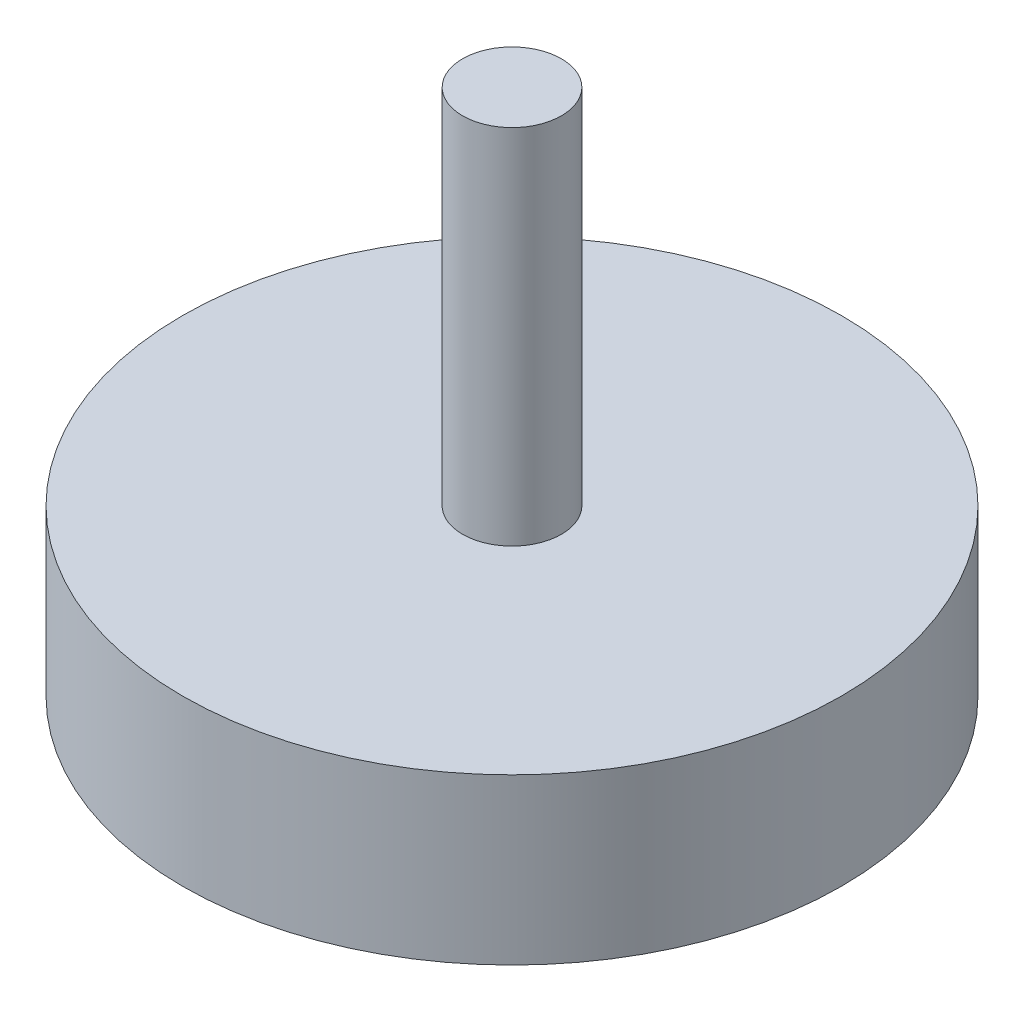
ISO-10303-21;
HEADER;
FILE_DESCRIPTION(('STEP AP214'),'2;1');
FILE_NAME('part.step','',(''),(''),'','','');
FILE_SCHEMA(('AUTOMOTIVE_DESIGN { 1 0 10303 214 1 1 1 1 }'));
ENDSEC;
DATA;
#1=APPLICATION_CONTEXT('core data for automotive mechanical design processes');
#2=APPLICATION_PROTOCOL_DEFINITION('international standard','automotive_design',2000,#1);
#3=PRODUCT_CONTEXT('',#1,'mechanical');
#4=PRODUCT('Part','Part','',(#3));
#5=PRODUCT_RELATED_PRODUCT_CATEGORY('part','',(#4));
#6=PRODUCT_DEFINITION_FORMATION('','',#4);
#7=PRODUCT_DEFINITION_CONTEXT('part definition',#1,'design');
#8=PRODUCT_DEFINITION('design','',#6,#7);
#9=PRODUCT_DEFINITION_SHAPE('','',#8);
#10=(LENGTH_UNIT() NAMED_UNIT(*) SI_UNIT(.MILLI.,.METRE.));
#11=(NAMED_UNIT(*) PLANE_ANGLE_UNIT() SI_UNIT($,.RADIAN.));
#12=(NAMED_UNIT(*) SI_UNIT($,.STERADIAN.) SOLID_ANGLE_UNIT());
#13=UNCERTAINTY_MEASURE_WITH_UNIT(LENGTH_MEASURE(1.E-05),#10,'distance_accuracy_value','');
#14=(GEOMETRIC_REPRESENTATION_CONTEXT(3) GLOBAL_UNCERTAINTY_ASSIGNED_CONTEXT((#13)) GLOBAL_UNIT_ASSIGNED_CONTEXT((#10,
#11,#12)) REPRESENTATION_CONTEXT('',''));
#15=CARTESIAN_POINT('',(0.,0.,0.));
#16=DIRECTION('',(0.,0.,1.));
#17=DIRECTION('',(1.,0.,0.));
#18=AXIS2_PLACEMENT_3D('',#15,#16,#17);
#19=CARTESIAN_POINT('',(0.,25.,0.));
#20=DIRECTION('',(0.,-1.,0.));
#21=DIRECTION('',(0.,0.,-1.));
#22=AXIS2_PLACEMENT_3D('',#19,#20,#21);
#23=CYLINDRICAL_SURFACE('',#22,50.);
#24=CARTESIAN_POINT('',(0.,25.,0.));
#25=DIRECTION('',(0.,1.,0.));
#26=DIRECTION('',(0.,0.,1.));
#27=AXIS2_PLACEMENT_3D('',#24,#25,#26);
#28=CIRCLE('',#27,50.);
#29=CARTESIAN_POINT('',(0.,25.,50.));
#30=VERTEX_POINT('',#29);
#31=EDGE_CURVE('E38',#30,#30,#28,.T.);
#32=ORIENTED_EDGE('',*,*,#31,.F.);
#33=EDGE_LOOP('',(#32));
#34=FACE_BOUND('',#33,.T.);
#35=CARTESIAN_POINT('',(0.,0.,0.));
#36=DIRECTION('',(0.,1.,0.));
#37=DIRECTION('',(0.,0.,1.));
#38=AXIS2_PLACEMENT_3D('',#35,#36,#37);
#39=CIRCLE('',#38,50.);
#40=CARTESIAN_POINT('',(0.,0.,50.));
#41=VERTEX_POINT('',#40);
#42=EDGE_CURVE('E34',#41,#41,#39,.T.);
#43=ORIENTED_EDGE('',*,*,#42,.T.);
#44=EDGE_LOOP('',(#43));
#45=FACE_BOUND('',#44,.T.);
#46=ADVANCED_FACE('F31',(#34,#45),#23,.T.);
#47=CARTESIAN_POINT('',(0.,25.,0.));
#48=DIRECTION('',(0.,1.,0.));
#49=DIRECTION('',(0.,0.,1.));
#50=AXIS2_PLACEMENT_3D('',#47,#48,#49);
#51=PLANE('',#50);
#52=CARTESIAN_POINT('',(0.,25.,0.));
#53=DIRECTION('',(0.,1.,0.));
#54=DIRECTION('',(0.,0.,1.));
#55=AXIS2_PLACEMENT_3D('',#52,#53,#54);
#56=CIRCLE('',#55,7.5);
#57=CARTESIAN_POINT('',(0.,25.,7.5));
#58=VERTEX_POINT('',#57);
#59=EDGE_CURVE('E10',#58,#58,#56,.T.);
#60=ORIENTED_EDGE('',*,*,#59,.F.);
#61=EDGE_LOOP('',(#60));
#62=FACE_BOUND('',#61,.T.);
#63=ORIENTED_EDGE('',*,*,#31,.T.);
#64=EDGE_LOOP('',(#63));
#65=FACE_BOUND('',#64,.T.);
#66=ADVANCED_FACE('F55',(#62,#65),#51,.T.);
#67=CARTESIAN_POINT('',(0.,0.,0.));
#68=DIRECTION('',(0.,1.,0.));
#69=DIRECTION('',(0.,0.,1.));
#70=AXIS2_PLACEMENT_3D('',#67,#68,#69);
#71=PLANE('',#70);
#72=ORIENTED_EDGE('',*,*,#42,.F.);
#73=EDGE_LOOP('',(#72));
#74=FACE_BOUND('',#73,.T.);
#75=ADVANCED_FACE('F52',(#74),#71,.F.);
#76=CARTESIAN_POINT('',(0.,80.,0.));
#77=DIRECTION('',(0.,-1.,0.));
#78=DIRECTION('',(0.,0.,-1.));
#79=AXIS2_PLACEMENT_3D('',#76,#77,#78);
#80=CYLINDRICAL_SURFACE('',#79,7.5);
#81=CARTESIAN_POINT('',(0.,80.,0.));
#82=DIRECTION('',(0.,1.,0.));
#83=DIRECTION('',(0.,0.,1.));
#84=AXIS2_PLACEMENT_3D('',#81,#82,#83);
#85=CIRCLE('',#84,7.5);
#86=CARTESIAN_POINT('',(0.,80.,7.5));
#87=VERTEX_POINT('',#86);
#88=EDGE_CURVE('E44',#87,#87,#85,.T.);
#89=ORIENTED_EDGE('',*,*,#88,.F.);
#90=EDGE_LOOP('',(#89));
#91=FACE_BOUND('',#90,.T.);
#92=ORIENTED_EDGE('',*,*,#59,.T.);
#93=EDGE_LOOP('',(#92));
#94=FACE_BOUND('',#93,.T.);
#95=ADVANCED_FACE('F54',(#91,#94),#80,.T.);
#96=CARTESIAN_POINT('',(0.,80.,0.));
#97=DIRECTION('',(0.,1.,0.));
#98=DIRECTION('',(0.,0.,1.));
#99=AXIS2_PLACEMENT_3D('',#96,#97,#98);
#100=PLANE('',#99);
#101=ORIENTED_EDGE('',*,*,#88,.T.);
#102=EDGE_LOOP('',(#101));
#103=FACE_BOUND('',#102,.T.);
#104=ADVANCED_FACE('F60',(#103),#100,.T.);
#105=CLOSED_SHELL('',(#46,#66,#75,#95,#104));
#106=MANIFOLD_SOLID_BREP('B2',#105);
#107=ADVANCED_BREP_SHAPE_REPRESENTATION('',(#18,#106),#14);
#108=SHAPE_DEFINITION_REPRESENTATION(#9,#107);
ENDSEC;
END-ISO-10303-21;
